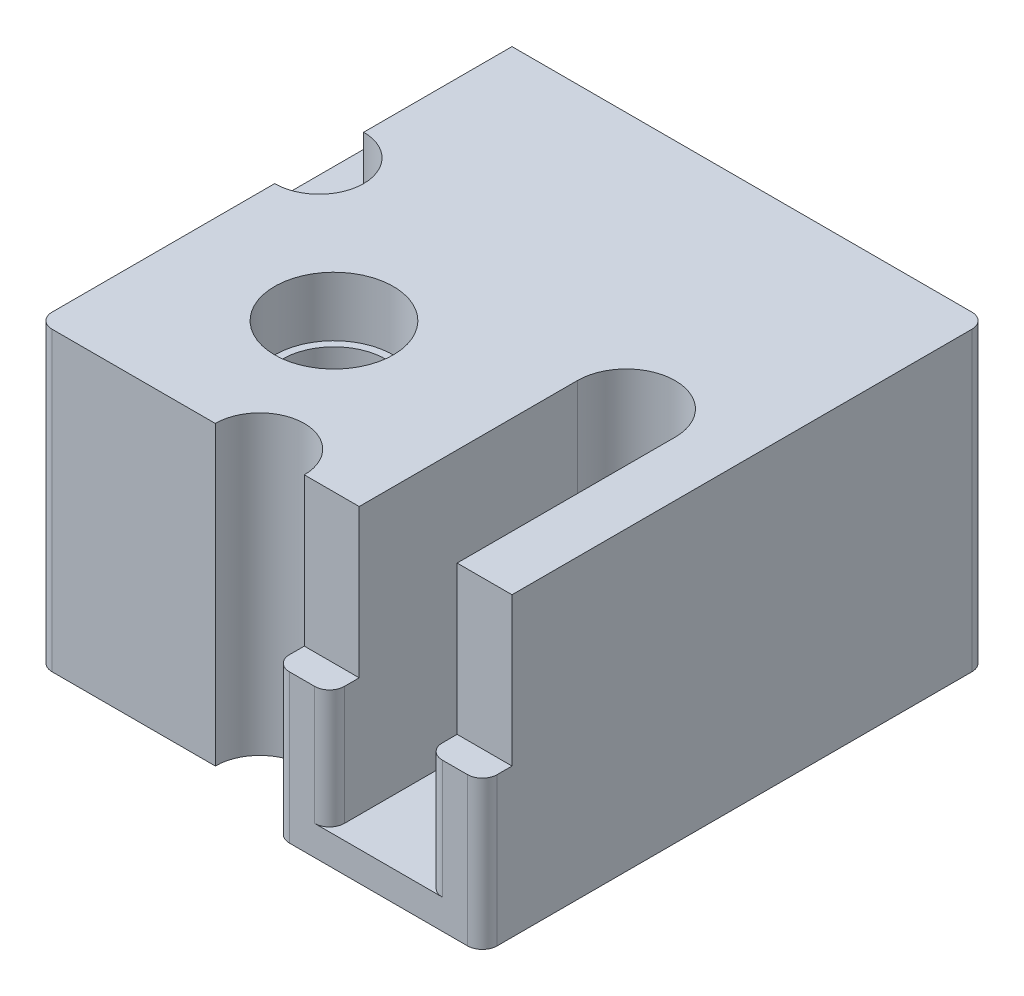
ISO-10303-21;
HEADER;
FILE_DESCRIPTION(('STEP AP214'),'2;1');
FILE_NAME('part.step','',(''),(''),'','','');
FILE_SCHEMA(('AUTOMOTIVE_DESIGN { 1 0 10303 214 1 1 1 1 }'));
ENDSEC;
DATA;
#1=APPLICATION_CONTEXT('core data for automotive mechanical design processes');
#2=APPLICATION_PROTOCOL_DEFINITION('international standard','automotive_design',2000,#1);
#3=PRODUCT_CONTEXT('',#1,'mechanical');
#4=PRODUCT('Part','Part','',(#3));
#5=PRODUCT_RELATED_PRODUCT_CATEGORY('part','',(#4));
#6=PRODUCT_DEFINITION_FORMATION('','',#4);
#7=PRODUCT_DEFINITION_CONTEXT('part definition',#1,'design');
#8=PRODUCT_DEFINITION('design','',#6,#7);
#9=PRODUCT_DEFINITION_SHAPE('','',#8);
#10=(LENGTH_UNIT() NAMED_UNIT(*) SI_UNIT(.MILLI.,.METRE.));
#11=(NAMED_UNIT(*) PLANE_ANGLE_UNIT() SI_UNIT($,.RADIAN.));
#12=(NAMED_UNIT(*) SI_UNIT($,.STERADIAN.) SOLID_ANGLE_UNIT());
#13=UNCERTAINTY_MEASURE_WITH_UNIT(LENGTH_MEASURE(1.E-05),#10,'distance_accuracy_value','');
#14=(GEOMETRIC_REPRESENTATION_CONTEXT(3) GLOBAL_UNCERTAINTY_ASSIGNED_CONTEXT((#13)) GLOBAL_UNIT_ASSIGNED_CONTEXT((#10,
#11,#12)) REPRESENTATION_CONTEXT('',''));
#15=CARTESIAN_POINT('',(0.,0.,0.));
#16=DIRECTION('',(0.,0.,1.));
#17=DIRECTION('',(1.,0.,0.));
#18=AXIS2_PLACEMENT_3D('',#15,#16,#17);
#19=CARTESIAN_POINT('',(13.5,5.,16.));
#20=DIRECTION('',(0.,0.,-1.));
#21=DIRECTION('',(-1.,0.,0.));
#22=AXIS2_PLACEMENT_3D('',#19,#20,#21);
#23=PLANE('',#22);
#24=DIRECTION('',(-1.,0.,0.));
#25=VECTOR('',#24,1.);
#26=CARTESIAN_POINT('',(13.5,5.,16.));
#27=LINE('',#26,#25);
#28=CARTESIAN_POINT('',(15.35,5.,16.));
#29=VERTEX_POINT('',#28);
#30=CARTESIAN_POINT('',(13.5,5.,16.));
#31=VERTEX_POINT('',#30);
#32=EDGE_CURVE('E282',#29,#31,#27,.T.);
#33=ORIENTED_EDGE('',*,*,#32,.F.);
#34=DIRECTION('',(0.,1.,0.));
#35=VECTOR('',#34,1.);
#36=CARTESIAN_POINT('',(15.35,5.,16.));
#37=LINE('',#36,#35);
#38=CARTESIAN_POINT('',(15.35,10.,16.));
#39=VERTEX_POINT('',#38);
#40=EDGE_CURVE('E251',#29,#39,#37,.T.);
#41=ORIENTED_EDGE('',*,*,#40,.T.);
#42=DIRECTION('',(-1.,0.,0.));
#43=VECTOR('',#42,1.);
#44=CARTESIAN_POINT('',(13.5,10.,16.));
#45=LINE('',#44,#43);
#46=CARTESIAN_POINT('',(13.5,10.,16.));
#47=VERTEX_POINT('',#46);
#48=EDGE_CURVE('E271',#39,#47,#45,.T.);
#49=ORIENTED_EDGE('',*,*,#48,.T.);
#50=DIRECTION('',(0.,-1.,0.));
#51=VECTOR('',#50,1.);
#52=CARTESIAN_POINT('',(13.5,10.,16.));
#53=LINE('',#52,#51);
#54=EDGE_CURVE('E348',#47,#31,#53,.T.);
#55=ORIENTED_EDGE('',*,*,#54,.T.);
#56=EDGE_LOOP('',(#33,#41,#49,#55));
#57=FACE_BOUND('',#56,.T.);
#58=ADVANCED_FACE('F34',(#57),#23,.F.);
#59=CARTESIAN_POINT('',(0.,5.,0.));
#60=DIRECTION('',(0.,1.,0.));
#61=DIRECTION('',(0.,0.,1.));
#62=AXIS2_PLACEMENT_3D('',#59,#60,#61);
#63=PLANE('',#62);
#64=DIRECTION('',(1.,0.,0.));
#65=VECTOR('',#64,1.);
#66=CARTESIAN_POINT('',(13.5,5.,17.));
#67=LINE('',#66,#65);
#68=CARTESIAN_POINT('',(14.,5.,17.));
#69=VERTEX_POINT('',#68);
#70=CARTESIAN_POINT('',(14.85,5.,17.));
#71=VERTEX_POINT('',#70);
#72=EDGE_CURVE('E277',#69,#71,#67,.T.);
#73=ORIENTED_EDGE('',*,*,#72,.T.);
#74=CARTESIAN_POINT('',(14.85,5.,16.5));
#75=DIRECTION('',(0.,1.,0.));
#76=DIRECTION('',(0.,0.,1.));
#77=AXIS2_PLACEMENT_3D('',#74,#75,#76);
#78=CIRCLE('',#77,0.5);
#79=CARTESIAN_POINT('',(15.35,5.,16.5));
#80=VERTEX_POINT('',#79);
#81=EDGE_CURVE('E383',#71,#80,#78,.T.);
#82=ORIENTED_EDGE('',*,*,#81,.T.);
#83=DIRECTION('',(0.,0.,1.));
#84=VECTOR('',#83,1.);
#85=CARTESIAN_POINT('',(15.35,5.,0.));
#86=LINE('',#85,#84);
#87=EDGE_CURVE('E359',#29,#80,#86,.T.);
#88=ORIENTED_EDGE('',*,*,#87,.F.);
#89=ORIENTED_EDGE('',*,*,#32,.T.);
#90=DIRECTION('',(0.,0.,1.));
#91=VECTOR('',#90,1.);
#92=CARTESIAN_POINT('',(13.5,5.,16.));
#93=LINE('',#92,#91);
#94=CARTESIAN_POINT('',(13.5,5.,16.5));
#95=VERTEX_POINT('',#94);
#96=EDGE_CURVE('E272',#31,#95,#93,.T.);
#97=ORIENTED_EDGE('',*,*,#96,.T.);
#98=CARTESIAN_POINT('',(14.,5.,16.5));
#99=DIRECTION('',(0.,1.,0.));
#100=DIRECTION('',(0.,0.,1.));
#101=AXIS2_PLACEMENT_3D('',#98,#99,#100);
#102=CIRCLE('',#101,0.5);
#103=EDGE_CURVE('E381',#95,#69,#102,.T.);
#104=ORIENTED_EDGE('',*,*,#103,.T.);
#105=EDGE_LOOP('',(#73,#82,#88,#89,#97,#104));
#106=FACE_BOUND('',#105,.T.);
#107=ADVANCED_FACE('F458',(#106),#63,.T.);
#108=CARTESIAN_POINT('',(0.,10.,0.));
#109=DIRECTION('',(1.,0.,0.));
#110=DIRECTION('',(0.,0.,-1.));
#111=AXIS2_PLACEMENT_3D('',#108,#109,#110);
#112=PLANE('',#111);
#113=DIRECTION('',(0.,0.,1.));
#114=VECTOR('',#113,1.);
#115=CARTESIAN_POINT('',(0.,5.,5.));
#116=LINE('',#115,#114);
#117=CARTESIAN_POINT('',(0.,5.,0.5));
#118=VERTEX_POINT('',#117);
#119=CARTESIAN_POINT('',(0.,5.,4.5));
#120=VERTEX_POINT('',#119);
#121=EDGE_CURVE('E261',#118,#120,#116,.T.);
#122=ORIENTED_EDGE('',*,*,#121,.F.);
#123=DIRECTION('',(0.,-1.,0.));
#124=VECTOR('',#123,1.);
#125=CARTESIAN_POINT('',(0.,10.,0.5));
#126=LINE('',#125,#124);
#127=CARTESIAN_POINT('',(0.,0.,0.5));
#128=VERTEX_POINT('',#127);
#129=EDGE_CURVE('E389',#118,#128,#126,.T.);
#130=ORIENTED_EDGE('',*,*,#129,.T.);
#131=DIRECTION('',(0.,0.,1.));
#132=VECTOR('',#131,1.);
#133=CARTESIAN_POINT('',(0.,0.,0.));
#134=LINE('',#133,#132);
#135=CARTESIAN_POINT('',(0.,0.,4.5));
#136=VERTEX_POINT('',#135);
#137=EDGE_CURVE('E334',#128,#136,#134,.T.);
#138=ORIENTED_EDGE('',*,*,#137,.T.);
#139=DIRECTION('',(0.,-1.,0.));
#140=VECTOR('',#139,1.);
#141=CARTESIAN_POINT('',(0.,10.,4.5));
#142=LINE('',#141,#140);
#143=EDGE_CURVE('E387',#136,#120,#142,.F.);
#144=ORIENTED_EDGE('',*,*,#143,.T.);
#145=EDGE_LOOP('',(#122,#130,#138,#144));
#146=FACE_BOUND('',#145,.T.);
#147=ADVANCED_FACE('F496',(#146),#112,.F.);
#148=CARTESIAN_POINT('',(4.5,10.,5.));
#149=DIRECTION('',(0.,0.,-1.));
#150=DIRECTION('',(-1.,0.,0.));
#151=AXIS2_PLACEMENT_3D('',#148,#149,#150);
#152=PLANE('',#151);
#153=DIRECTION('',(1.,0.,0.));
#154=VECTOR('',#153,1.);
#155=CARTESIAN_POINT('',(4.5,5.,5.));
#156=LINE('',#155,#154);
#157=CARTESIAN_POINT('',(0.500000000000001,5.,5.));
#158=VERTEX_POINT('',#157);
#159=CARTESIAN_POINT('',(4.5,5.,5.));
#160=VERTEX_POINT('',#159);
#161=EDGE_CURVE('E264',#158,#160,#156,.T.);
#162=ORIENTED_EDGE('',*,*,#161,.F.);
#163=DIRECTION('',(0.,-1.,0.));
#164=VECTOR('',#163,1.);
#165=CARTESIAN_POINT('',(0.500000000000001,10.,5.));
#166=LINE('',#165,#164);
#167=CARTESIAN_POINT('',(0.500000000000001,0.,5.));
#168=VERTEX_POINT('',#167);
#169=EDGE_CURVE('E413',#158,#168,#166,.T.);
#170=ORIENTED_EDGE('',*,*,#169,.T.);
#171=DIRECTION('',(1.,0.,0.));
#172=VECTOR('',#171,1.);
#173=CARTESIAN_POINT('',(4.5,0.,5.));
#174=LINE('',#173,#172);
#175=CARTESIAN_POINT('',(4.5,0.,5.));
#176=VERTEX_POINT('',#175);
#177=EDGE_CURVE('E337',#168,#176,#174,.T.);
#178=ORIENTED_EDGE('',*,*,#177,.T.);
#179=DIRECTION('',(0.,-1.,0.));
#180=VECTOR('',#179,1.);
#181=CARTESIAN_POINT('',(4.5,10.,5.));
#182=LINE('',#181,#180);
#183=EDGE_CURVE('E351',#160,#176,#182,.T.);
#184=ORIENTED_EDGE('',*,*,#183,.F.);
#185=EDGE_LOOP('',(#162,#170,#178,#184));
#186=FACE_BOUND('',#185,.T.);
#187=ADVANCED_FACE('F507',(#186),#152,.F.);
#188=CARTESIAN_POINT('',(13.5,10.,16.));
#189=DIRECTION('',(1.,0.,0.));
#190=DIRECTION('',(0.,0.,-1.));
#191=AXIS2_PLACEMENT_3D('',#188,#189,#190);
#192=PLANE('',#191);
#193=DIRECTION('',(0.,0.,1.));
#194=VECTOR('',#193,1.);
#195=CARTESIAN_POINT('',(13.5,0.,16.));
#196=LINE('',#195,#194);
#197=CARTESIAN_POINT('',(13.5,0.,16.));
#198=VERTEX_POINT('',#197);
#199=CARTESIAN_POINT('',(13.5,0.,16.5));
#200=VERTEX_POINT('',#199);
#201=EDGE_CURVE('E343',#198,#200,#196,.T.);
#202=ORIENTED_EDGE('',*,*,#201,.T.);
#203=DIRECTION('',(0.,-1.,0.));
#204=VECTOR('',#203,1.);
#205=CARTESIAN_POINT('',(13.5,10.,16.5));
#206=LINE('',#205,#204);
#207=EDGE_CURVE('E424',#200,#95,#206,.F.);
#208=ORIENTED_EDGE('',*,*,#207,.T.);
#209=ORIENTED_EDGE('',*,*,#96,.F.);
#210=EDGE_CURVE('E328',#31,#198,#53,.T.);
#211=ORIENTED_EDGE('',*,*,#210,.T.);
#212=EDGE_LOOP('',(#202,#208,#209,#211));
#213=FACE_BOUND('',#212,.T.);
#214=ADVANCED_FACE('F562',(#213),#192,.F.);
#215=CARTESIAN_POINT('',(20.5,10.,17.));
#216=DIRECTION('',(0.,0.,-1.));
#217=DIRECTION('',(-1.,0.,0.));
#218=AXIS2_PLACEMENT_3D('',#215,#216,#217);
#219=PLANE('',#218);
#220=CARTESIAN_POINT('',(19.15,5.,17.));
#221=VERTEX_POINT('',#220);
#222=CARTESIAN_POINT('',(20.,5.,17.));
#223=VERTEX_POINT('',#222);
#224=EDGE_CURVE('E275',#221,#223,#67,.T.);
#225=ORIENTED_EDGE('',*,*,#224,.F.);
#226=DIRECTION('',(0.,1.,0.));
#227=VECTOR('',#226,1.);
#228=CARTESIAN_POINT('',(19.15,10.,17.));
#229=LINE('',#228,#227);
#230=CARTESIAN_POINT('',(19.15,1.,17.));
#231=VERTEX_POINT('',#230);
#232=EDGE_CURVE('E378',#221,#231,#229,.F.);
#233=ORIENTED_EDGE('',*,*,#232,.T.);
#234=DIRECTION('',(1.,0.,0.));
#235=VECTOR('',#234,1.);
#236=CARTESIAN_POINT('',(20.5,1.,17.));
#237=LINE('',#236,#235);
#238=CARTESIAN_POINT('',(14.85,1.,17.));
#239=VERTEX_POINT('',#238);
#240=EDGE_CURVE('E362',#239,#231,#237,.T.);
#241=ORIENTED_EDGE('',*,*,#240,.F.);
#242=DIRECTION('',(0.,1.,0.));
#243=VECTOR('',#242,1.);
#244=CARTESIAN_POINT('',(14.85,10.,17.));
#245=LINE('',#244,#243);
#246=EDGE_CURVE('E375',#239,#71,#245,.T.);
#247=ORIENTED_EDGE('',*,*,#246,.T.);
#248=ORIENTED_EDGE('',*,*,#72,.F.);
#249=DIRECTION('',(0.,-1.,0.));
#250=VECTOR('',#249,1.);
#251=CARTESIAN_POINT('',(14.,10.,17.));
#252=LINE('',#251,#250);
#253=CARTESIAN_POINT('',(14.,0.,17.));
#254=VERTEX_POINT('',#253);
#255=EDGE_CURVE('E372',#69,#254,#252,.T.);
#256=ORIENTED_EDGE('',*,*,#255,.T.);
#257=DIRECTION('',(1.,0.,0.));
#258=VECTOR('',#257,1.);
#259=CARTESIAN_POINT('',(20.5,0.,17.));
#260=LINE('',#259,#258);
#261=CARTESIAN_POINT('',(20.,0.,17.));
#262=VERTEX_POINT('',#261);
#263=EDGE_CURVE('E322',#254,#262,#260,.T.);
#264=ORIENTED_EDGE('',*,*,#263,.T.);
#265=DIRECTION('',(0.,-1.,0.));
#266=VECTOR('',#265,1.);
#267=CARTESIAN_POINT('',(20.,10.,17.));
#268=LINE('',#267,#266);
#269=EDGE_CURVE('E370',#262,#223,#268,.F.);
#270=ORIENTED_EDGE('',*,*,#269,.T.);
#271=EDGE_LOOP('',(#225,#233,#241,#247,#248,#256,#264,#270));
#272=FACE_BOUND('',#271,.T.);
#273=ADVANCED_FACE('F466',(#272),#219,.F.);
#274=CARTESIAN_POINT('',(9.5,0.,11.));
#275=DIRECTION('',(0.,1.,0.));
#276=DIRECTION('',(0.,0.,1.));
#277=AXIS2_PLACEMENT_3D('',#274,#275,#276);
#278=CYLINDRICAL_SURFACE('',#277,1.75);
#279=CARTESIAN_POINT('',(9.5,0.,11.));
#280=DIRECTION('',(0.,1.,0.));
#281=DIRECTION('',(0.,0.,1.));
#282=AXIS2_PLACEMENT_3D('',#279,#280,#281);
#283=CIRCLE('',#282,1.75);
#284=CARTESIAN_POINT('',(9.5,0.,12.75));
#285=VERTEX_POINT('',#284);
#286=EDGE_CURVE('E314',#285,#285,#283,.T.);
#287=ORIENTED_EDGE('',*,*,#286,.F.);
#288=EDGE_LOOP('',(#287));
#289=FACE_BOUND('',#288,.T.);
#290=CARTESIAN_POINT('',(9.5,8.,11.));
#291=DIRECTION('',(0.,1.,0.));
#292=DIRECTION('',(0.,0.,1.));
#293=AXIS2_PLACEMENT_3D('',#290,#291,#292);
#294=CIRCLE('',#293,1.75);
#295=CARTESIAN_POINT('',(9.5,8.,12.75));
#296=VERTEX_POINT('',#295);
#297=EDGE_CURVE('E311',#296,#296,#294,.F.);
#298=ORIENTED_EDGE('',*,*,#297,.F.);
#299=EDGE_LOOP('',(#298));
#300=FACE_BOUND('',#299,.T.);
#301=ADVANCED_FACE('F551',(#289,#300),#278,.F.);
#302=CARTESIAN_POINT('',(20.5,10.,0.));
#303=DIRECTION('',(-1.,0.,0.));
#304=DIRECTION('',(0.,0.,1.));
#305=AXIS2_PLACEMENT_3D('',#302,#303,#304);
#306=PLANE('',#305);
#307=DIRECTION('',(0.,0.,-1.));
#308=VECTOR('',#307,1.);
#309=CARTESIAN_POINT('',(20.5,0.,0.));
#310=LINE('',#309,#308);
#311=CARTESIAN_POINT('',(20.5,0.,16.5));
#312=VERTEX_POINT('',#311);
#313=CARTESIAN_POINT('',(20.5,0.,0.5));
#314=VERTEX_POINT('',#313);
#315=EDGE_CURVE('E317',#312,#314,#310,.T.);
#316=ORIENTED_EDGE('',*,*,#315,.T.);
#317=DIRECTION('',(0.,-1.,0.));
#318=VECTOR('',#317,1.);
#319=CARTESIAN_POINT('',(20.5,10.,0.5));
#320=LINE('',#319,#318);
#321=CARTESIAN_POINT('',(20.5,10.,0.5));
#322=VERTEX_POINT('',#321);
#323=EDGE_CURVE('E419',#314,#322,#320,.F.);
#324=ORIENTED_EDGE('',*,*,#323,.T.);
#325=DIRECTION('',(0.,0.,-1.));
#326=VECTOR('',#325,1.);
#327=CARTESIAN_POINT('',(20.5,10.,0.));
#328=LINE('',#327,#326);
#329=CARTESIAN_POINT('',(20.5,10.,16.));
#330=VERTEX_POINT('',#329);
#331=EDGE_CURVE('E318',#330,#322,#328,.T.);
#332=ORIENTED_EDGE('',*,*,#331,.F.);
#333=DIRECTION('',(0.,1.,0.));
#334=VECTOR('',#333,1.);
#335=CARTESIAN_POINT('',(20.5,5.,16.));
#336=LINE('',#335,#334);
#337=CARTESIAN_POINT('',(20.5,5.,16.));
#338=VERTEX_POINT('',#337);
#339=EDGE_CURVE('E286',#338,#330,#336,.T.);
#340=ORIENTED_EDGE('',*,*,#339,.F.);
#341=DIRECTION('',(0.,0.,-1.));
#342=VECTOR('',#341,1.);
#343=CARTESIAN_POINT('',(20.5,5.,16.));
#344=LINE('',#343,#342);
#345=CARTESIAN_POINT('',(20.5,5.,16.5));
#346=VERTEX_POINT('',#345);
#347=EDGE_CURVE('E280',#346,#338,#344,.T.);
#348=ORIENTED_EDGE('',*,*,#347,.F.);
#349=DIRECTION('',(0.,-1.,0.));
#350=VECTOR('',#349,1.);
#351=CARTESIAN_POINT('',(20.5,10.,16.5));
#352=LINE('',#351,#350);
#353=EDGE_CURVE('E416',#346,#312,#352,.T.);
#354=ORIENTED_EDGE('',*,*,#353,.T.);
#355=EDGE_LOOP('',(#316,#324,#332,#340,#348,#354));
#356=FACE_BOUND('',#355,.T.);
#357=ADVANCED_FACE('F477',(#356),#306,.F.);
#358=CARTESIAN_POINT('',(0.,10.,0.));
#359=DIRECTION('',(0.,0.,1.));
#360=DIRECTION('',(1.,0.,0.));
#361=AXIS2_PLACEMENT_3D('',#358,#359,#360);
#362=PLANE('',#361);
#363=DIRECTION('',(-1.,0.,0.));
#364=VECTOR('',#363,1.);
#365=CARTESIAN_POINT('',(0.,0.,0.));
#366=LINE('',#365,#364);
#367=CARTESIAN_POINT('',(20.,0.,0.));
#368=VERTEX_POINT('',#367);
#369=CARTESIAN_POINT('',(0.5,0.,0.));
#370=VERTEX_POINT('',#369);
#371=EDGE_CURVE('E331',#368,#370,#366,.T.);
#372=ORIENTED_EDGE('',*,*,#371,.T.);
#373=DIRECTION('',(0.,-1.,0.));
#374=VECTOR('',#373,1.);
#375=CARTESIAN_POINT('',(0.5,10.,0.));
#376=LINE('',#375,#374);
#377=CARTESIAN_POINT('',(0.5,5.,0.));
#378=VERTEX_POINT('',#377);
#379=EDGE_CURVE('E407',#370,#378,#376,.F.);
#380=ORIENTED_EDGE('',*,*,#379,.T.);
#381=DIRECTION('',(-1.,0.,0.));
#382=VECTOR('',#381,1.);
#383=CARTESIAN_POINT('',(4.5,5.,0.));
#384=LINE('',#383,#382);
#385=CARTESIAN_POINT('',(4.5,5.,0.));
#386=VERTEX_POINT('',#385);
#387=EDGE_CURVE('E258',#386,#378,#384,.T.);
#388=ORIENTED_EDGE('',*,*,#387,.F.);
#389=DIRECTION('',(0.,1.,0.));
#390=VECTOR('',#389,1.);
#391=CARTESIAN_POINT('',(4.5,5.,0.));
#392=LINE('',#391,#390);
#393=CARTESIAN_POINT('',(4.5,10.,0.));
#394=VERTEX_POINT('',#393);
#395=EDGE_CURVE('E266',#386,#394,#392,.T.);
#396=ORIENTED_EDGE('',*,*,#395,.T.);
#397=DIRECTION('',(-1.,0.,0.));
#398=VECTOR('',#397,1.);
#399=CARTESIAN_POINT('',(0.,10.,0.));
#400=LINE('',#399,#398);
#401=CARTESIAN_POINT('',(20.,10.,0.));
#402=VERTEX_POINT('',#401);
#403=EDGE_CURVE('E321',#402,#394,#400,.T.);
#404=ORIENTED_EDGE('',*,*,#403,.F.);
#405=DIRECTION('',(0.,-1.,0.));
#406=VECTOR('',#405,1.);
#407=CARTESIAN_POINT('',(20.,10.,0.));
#408=LINE('',#407,#406);
#409=EDGE_CURVE('E404',#402,#368,#408,.T.);
#410=ORIENTED_EDGE('',*,*,#409,.T.);
#411=EDGE_LOOP('',(#372,#380,#388,#396,#404,#410));
#412=FACE_BOUND('',#411,.T.);
#413=ADVANCED_FACE('F487',(#412),#362,.F.);
#414=CARTESIAN_POINT('',(4.5,10.,5.));
#415=DIRECTION('',(1.,0.,0.));
#416=DIRECTION('',(0.,0.,-1.));
#417=AXIS2_PLACEMENT_3D('',#414,#415,#416);
#418=PLANE('',#417);
#419=DIRECTION('',(0.,0.,1.));
#420=VECTOR('',#419,1.);
#421=CARTESIAN_POINT('',(4.5,0.,5.));
#422=LINE('',#421,#420);
#423=CARTESIAN_POINT('',(4.5,0.,8.));
#424=VERTEX_POINT('',#423);
#425=CARTESIAN_POINT('',(4.5,0.,15.5));
#426=VERTEX_POINT('',#425);
#427=EDGE_CURVE('E339',#424,#426,#422,.T.);
#428=ORIENTED_EDGE('',*,*,#427,.T.);
#429=DIRECTION('',(0.,-1.,0.));
#430=VECTOR('',#429,1.);
#431=CARTESIAN_POINT('',(4.5,10.,15.5));
#432=LINE('',#431,#430);
#433=CARTESIAN_POINT('',(4.5,10.,15.5));
#434=VERTEX_POINT('',#433);
#435=EDGE_CURVE('E57',#426,#434,#432,.F.);
#436=ORIENTED_EDGE('',*,*,#435,.T.);
#437=DIRECTION('',(0.,0.,1.));
#438=VECTOR('',#437,1.);
#439=CARTESIAN_POINT('',(4.5,10.,5.));
#440=LINE('',#439,#438);
#441=CARTESIAN_POINT('',(4.5,10.,8.));
#442=VERTEX_POINT('',#441);
#443=EDGE_CURVE('E324',#442,#434,#440,.T.);
#444=ORIENTED_EDGE('',*,*,#443,.F.);
#445=DIRECTION('',(0.,-1.,0.));
#446=VECTOR('',#445,1.);
#447=CARTESIAN_POINT('',(4.5,10.,8.));
#448=LINE('',#447,#446);
#449=EDGE_CURVE('E303',#442,#424,#448,.T.);
#450=ORIENTED_EDGE('',*,*,#449,.T.);
#451=EDGE_LOOP('',(#428,#436,#444,#450));
#452=FACE_BOUND('',#451,.T.);
#453=ADVANCED_FACE('F514',(#452),#418,.F.);
#454=CARTESIAN_POINT('',(4.5,10.,16.));
#455=DIRECTION('',(0.,0.,-1.));
#456=DIRECTION('',(-1.,0.,0.));
#457=AXIS2_PLACEMENT_3D('',#454,#455,#456);
#458=PLANE('',#457);
#459=DIRECTION('',(1.,0.,0.));
#460=VECTOR('',#459,1.);
#461=CARTESIAN_POINT('',(4.5,10.,16.));
#462=LINE('',#461,#460);
#463=CARTESIAN_POINT('',(5.,10.,16.));
#464=VERTEX_POINT('',#463);
#465=CARTESIAN_POINT('',(10.5,10.,16.));
#466=VERTEX_POINT('',#465);
#467=EDGE_CURVE('E326',#464,#466,#462,.T.);
#468=ORIENTED_EDGE('',*,*,#467,.F.);
#469=DIRECTION('',(0.,-1.,0.));
#470=VECTOR('',#469,1.);
#471=CARTESIAN_POINT('',(5.,10.,16.));
#472=LINE('',#471,#470);
#473=CARTESIAN_POINT('',(5.,0.,16.));
#474=VERTEX_POINT('',#473);
#475=EDGE_CURVE('E426',#464,#474,#472,.T.);
#476=ORIENTED_EDGE('',*,*,#475,.T.);
#477=DIRECTION('',(1.,0.,0.));
#478=VECTOR('',#477,1.);
#479=CARTESIAN_POINT('',(4.5,0.,16.));
#480=LINE('',#479,#478);
#481=CARTESIAN_POINT('',(10.5,0.,16.));
#482=VERTEX_POINT('',#481);
#483=EDGE_CURVE('E341',#474,#482,#480,.T.);
#484=ORIENTED_EDGE('',*,*,#483,.T.);
#485=DIRECTION('',(0.,-1.,0.));
#486=VECTOR('',#485,1.);
#487=CARTESIAN_POINT('',(10.5,10.,16.));
#488=LINE('',#487,#486);
#489=EDGE_CURVE('E294',#466,#482,#488,.T.);
#490=ORIENTED_EDGE('',*,*,#489,.F.);
#491=EDGE_LOOP('',(#468,#476,#484,#490));
#492=FACE_BOUND('',#491,.T.);
#493=ADVANCED_FACE('F432',(#492),#458,.F.);
#494=CARTESIAN_POINT('',(20.5,10.,17.));
#495=DIRECTION('',(0.,-1.,0.));
#496=DIRECTION('',(0.,0.,-1.));
#497=AXIS2_PLACEMENT_3D('',#494,#495,#496);
#498=PLANE('',#497);
#499=CARTESIAN_POINT('',(9.5,10.,11.));
#500=DIRECTION('',(0.,1.,0.));
#501=DIRECTION('',(0.,0.,1.));
#502=AXIS2_PLACEMENT_3D('',#499,#500,#501);
#503=CIRCLE('',#502,2.);
#504=CARTESIAN_POINT('',(9.5,10.,13.));
#505=VERTEX_POINT('',#504);
#506=EDGE_CURVE('E307',#505,#505,#503,.T.);
#507=ORIENTED_EDGE('',*,*,#506,.F.);
#508=EDGE_LOOP('',(#507));
#509=FACE_BOUND('',#508,.T.);
#510=ORIENTED_EDGE('',*,*,#331,.T.);
#511=CARTESIAN_POINT('',(20.,10.,0.5));
#512=DIRECTION('',(0.,-1.,0.));
#513=DIRECTION('',(0.,0.,-1.));
#514=AXIS2_PLACEMENT_3D('',#511,#512,#513);
#515=CIRCLE('',#514,0.5);
#516=EDGE_CURVE('E422',#322,#402,#515,.F.);
#517=ORIENTED_EDGE('',*,*,#516,.T.);
#518=ORIENTED_EDGE('',*,*,#403,.T.);
#519=DIRECTION('',(0.,0.,-1.));
#520=VECTOR('',#519,1.);
#521=CARTESIAN_POINT('',(4.5,10.,5.));
#522=LINE('',#521,#520);
#523=CARTESIAN_POINT('',(4.5,10.,5.));
#524=VERTEX_POINT('',#523);
#525=EDGE_CURVE('E254',#524,#394,#522,.T.);
#526=ORIENTED_EDGE('',*,*,#525,.F.);
#527=CARTESIAN_POINT('',(4.5,10.,6.5));
#528=DIRECTION('',(0.,-1.,0.));
#529=DIRECTION('',(0.,0.,-1.));
#530=AXIS2_PLACEMENT_3D('',#527,#528,#529);
#531=CIRCLE('',#530,1.5);
#532=EDGE_CURVE('E300',#524,#442,#531,.T.);
#533=ORIENTED_EDGE('',*,*,#532,.T.);
#534=ORIENTED_EDGE('',*,*,#443,.T.);
#535=CARTESIAN_POINT('',(5.,10.,15.5));
#536=DIRECTION('',(0.,-1.,0.));
#537=DIRECTION('',(0.,0.,-1.));
#538=AXIS2_PLACEMENT_3D('',#535,#536,#537);
#539=CIRCLE('',#538,0.5);
#540=EDGE_CURVE('E49',#434,#464,#539,.F.);
#541=ORIENTED_EDGE('',*,*,#540,.T.);
#542=ORIENTED_EDGE('',*,*,#467,.T.);
#543=CARTESIAN_POINT('',(12.,10.,16.));
#544=DIRECTION('',(0.,-1.,0.));
#545=DIRECTION('',(0.,0.,-1.));
#546=AXIS2_PLACEMENT_3D('',#543,#544,#545);
#547=CIRCLE('',#546,1.5);
#548=EDGE_CURVE('E291',#466,#47,#547,.T.);
#549=ORIENTED_EDGE('',*,*,#548,.T.);
#550=ORIENTED_EDGE('',*,*,#48,.F.);
#551=DIRECTION('',(0.,0.,1.));
#552=VECTOR('',#551,1.);
#553=CARTESIAN_POINT('',(15.35,10.,17.));
#554=LINE('',#553,#552);
#555=CARTESIAN_POINT('',(15.35,10.,8.65));
#556=VERTEX_POINT('',#555);
#557=EDGE_CURVE('E226',#556,#39,#554,.T.);
#558=ORIENTED_EDGE('',*,*,#557,.F.);
#559=CARTESIAN_POINT('',(17.,10.,8.65));
#560=DIRECTION('',(0.,1.,0.));
#561=DIRECTION('',(0.,0.,1.));
#562=AXIS2_PLACEMENT_3D('',#559,#560,#561);
#563=CIRCLE('',#562,1.65);
#564=CARTESIAN_POINT('',(18.65,10.,8.65));
#565=VERTEX_POINT('',#564);
#566=EDGE_CURVE('E244',#565,#556,#563,.T.);
#567=ORIENTED_EDGE('',*,*,#566,.F.);
#568=DIRECTION('',(0.,0.,-1.));
#569=VECTOR('',#568,1.);
#570=CARTESIAN_POINT('',(18.65,10.,17.));
#571=LINE('',#570,#569);
#572=CARTESIAN_POINT('',(18.65,10.,16.));
#573=VERTEX_POINT('',#572);
#574=EDGE_CURVE('E232',#573,#565,#571,.T.);
#575=ORIENTED_EDGE('',*,*,#574,.F.);
#576=EDGE_CURVE('E276',#330,#573,#45,.T.);
#577=ORIENTED_EDGE('',*,*,#576,.F.);
#578=EDGE_LOOP('',(#510,#517,#518,#526,#533,#534,#541,#542,#549,#550,#558,#567,#575,#577));
#579=FACE_BOUND('',#578,.T.);
#580=ADVANCED_FACE('F448',(#509,#579),#498,.F.);
#581=CARTESIAN_POINT('',(20.5,0.,17.));
#582=DIRECTION('',(0.,-1.,0.));
#583=DIRECTION('',(0.,0.,-1.));
#584=AXIS2_PLACEMENT_3D('',#581,#582,#583);
#585=PLANE('',#584);
#586=ORIENTED_EDGE('',*,*,#137,.F.);
#587=CARTESIAN_POINT('',(0.5,0.,0.5));
#588=DIRECTION('',(0.,-1.,0.));
#589=DIRECTION('',(0.,0.,-1.));
#590=AXIS2_PLACEMENT_3D('',#587,#588,#589);
#591=CIRCLE('',#590,0.5);
#592=EDGE_CURVE('E402',#128,#370,#591,.T.);
#593=ORIENTED_EDGE('',*,*,#592,.T.);
#594=ORIENTED_EDGE('',*,*,#371,.F.);
#595=CARTESIAN_POINT('',(20.,0.,0.5));
#596=DIRECTION('',(0.,-1.,0.));
#597=DIRECTION('',(0.,0.,-1.));
#598=AXIS2_PLACEMENT_3D('',#595,#596,#597);
#599=CIRCLE('',#598,0.5);
#600=EDGE_CURVE('E398',#368,#314,#599,.T.);
#601=ORIENTED_EDGE('',*,*,#600,.T.);
#602=ORIENTED_EDGE('',*,*,#315,.F.);
#603=CARTESIAN_POINT('',(20.,0.,16.5));
#604=DIRECTION('',(0.,-1.,0.));
#605=DIRECTION('',(0.,0.,-1.));
#606=AXIS2_PLACEMENT_3D('',#603,#604,#605);
#607=CIRCLE('',#606,0.5);
#608=EDGE_CURVE('E394',#312,#262,#607,.T.);
#609=ORIENTED_EDGE('',*,*,#608,.T.);
#610=ORIENTED_EDGE('',*,*,#263,.F.);
#611=CARTESIAN_POINT('',(14.,0.,16.5));
#612=DIRECTION('',(0.,-1.,0.));
#613=DIRECTION('',(0.,0.,-1.));
#614=AXIS2_PLACEMENT_3D('',#611,#612,#613);
#615=CIRCLE('',#614,0.5);
#616=EDGE_CURVE('E396',#254,#200,#615,.T.);
#617=ORIENTED_EDGE('',*,*,#616,.T.);
#618=ORIENTED_EDGE('',*,*,#201,.F.);
#619=CARTESIAN_POINT('',(12.,0.,16.));
#620=DIRECTION('',(0.,-1.,0.));
#621=DIRECTION('',(0.,0.,-1.));
#622=AXIS2_PLACEMENT_3D('',#619,#620,#621);
#623=CIRCLE('',#622,1.5);
#624=EDGE_CURVE('E290',#482,#198,#623,.T.);
#625=ORIENTED_EDGE('',*,*,#624,.F.);
#626=ORIENTED_EDGE('',*,*,#483,.F.);
#627=CARTESIAN_POINT('',(5.,0.,15.5));
#628=DIRECTION('',(0.,-1.,0.));
#629=DIRECTION('',(0.,0.,-1.));
#630=AXIS2_PLACEMENT_3D('',#627,#628,#629);
#631=CIRCLE('',#630,0.5);
#632=EDGE_CURVE('E392',#474,#426,#631,.T.);
#633=ORIENTED_EDGE('',*,*,#632,.T.);
#634=ORIENTED_EDGE('',*,*,#427,.F.);
#635=CARTESIAN_POINT('',(4.5,0.,6.5));
#636=DIRECTION('',(0.,-1.,0.));
#637=DIRECTION('',(0.,0.,-1.));
#638=AXIS2_PLACEMENT_3D('',#635,#636,#637);
#639=CIRCLE('',#638,1.5);
#640=EDGE_CURVE('E299',#176,#424,#639,.T.);
#641=ORIENTED_EDGE('',*,*,#640,.F.);
#642=ORIENTED_EDGE('',*,*,#177,.F.);
#643=CARTESIAN_POINT('',(0.500000000000001,0.,4.5));
#644=DIRECTION('',(0.,-1.,0.));
#645=DIRECTION('',(0.,0.,-1.));
#646=AXIS2_PLACEMENT_3D('',#643,#644,#645);
#647=CIRCLE('',#646,0.5);
#648=EDGE_CURVE('E400',#168,#136,#647,.T.);
#649=ORIENTED_EDGE('',*,*,#648,.T.);
#650=EDGE_LOOP('',(#586,#593,#594,#601,#602,#609,#610,#617,#618,#625,#626,#633,#634,#641,#642,#649));
#651=FACE_BOUND('',#650,.T.);
#652=ORIENTED_EDGE('',*,*,#286,.T.);
#653=EDGE_LOOP('',(#652));
#654=FACE_BOUND('',#653,.T.);
#655=ADVANCED_FACE('F438',(#651,#654),#585,.T.);
#656=CARTESIAN_POINT('',(9.5,8.,11.));
#657=DIRECTION('',(0.,1.,0.));
#658=DIRECTION('',(0.,0.,1.));
#659=AXIS2_PLACEMENT_3D('',#656,#657,#658);
#660=PLANE('',#659);
#661=CARTESIAN_POINT('',(9.5,8.,11.));
#662=DIRECTION('',(0.,1.,0.));
#663=DIRECTION('',(0.,0.,1.));
#664=AXIS2_PLACEMENT_3D('',#661,#662,#663);
#665=CIRCLE('',#664,2.);
#666=CARTESIAN_POINT('',(9.5,8.,13.));
#667=VERTEX_POINT('',#666);
#668=EDGE_CURVE('E308',#667,#667,#665,.T.);
#669=ORIENTED_EDGE('',*,*,#668,.T.);
#670=EDGE_LOOP('',(#669));
#671=FACE_BOUND('',#670,.T.);
#672=ORIENTED_EDGE('',*,*,#297,.T.);
#673=EDGE_LOOP('',(#672));
#674=FACE_BOUND('',#673,.T.);
#675=ADVANCED_FACE('F544',(#671,#674),#660,.T.);
#676=CARTESIAN_POINT('',(9.5,8.,11.));
#677=DIRECTION('',(0.,1.,0.));
#678=DIRECTION('',(0.,0.,1.));
#679=AXIS2_PLACEMENT_3D('',#676,#677,#678);
#680=CYLINDRICAL_SURFACE('',#679,2.);
#681=ORIENTED_EDGE('',*,*,#668,.F.);
#682=EDGE_LOOP('',(#681));
#683=FACE_BOUND('',#682,.T.);
#684=ORIENTED_EDGE('',*,*,#506,.T.);
#685=EDGE_LOOP('',(#684));
#686=FACE_BOUND('',#685,.T.);
#687=ADVANCED_FACE('F541',(#683,#686),#680,.F.);
#688=CARTESIAN_POINT('',(4.5,10.,6.5));
#689=DIRECTION('',(0.,-1.,0.));
#690=DIRECTION('',(0.,0.,-1.));
#691=AXIS2_PLACEMENT_3D('',#688,#689,#690);
#692=CYLINDRICAL_SURFACE('',#691,1.5);
#693=ORIENTED_EDGE('',*,*,#640,.T.);
#694=ORIENTED_EDGE('',*,*,#449,.F.);
#695=ORIENTED_EDGE('',*,*,#532,.F.);
#696=EDGE_CURVE('E352',#524,#160,#182,.T.);
#697=ORIENTED_EDGE('',*,*,#696,.T.);
#698=ORIENTED_EDGE('',*,*,#183,.T.);
#699=EDGE_LOOP('',(#693,#694,#695,#697,#698));
#700=FACE_BOUND('',#699,.T.);
#701=ADVANCED_FACE('F512',(#700),#692,.F.);
#702=CARTESIAN_POINT('',(12.,10.,16.));
#703=DIRECTION('',(0.,-1.,0.));
#704=DIRECTION('',(0.,0.,-1.));
#705=AXIS2_PLACEMENT_3D('',#702,#703,#704);
#706=CYLINDRICAL_SURFACE('',#705,1.5);
#707=ORIENTED_EDGE('',*,*,#624,.T.);
#708=ORIENTED_EDGE('',*,*,#210,.F.);
#709=ORIENTED_EDGE('',*,*,#54,.F.);
#710=ORIENTED_EDGE('',*,*,#548,.F.);
#711=ORIENTED_EDGE('',*,*,#489,.T.);
#712=EDGE_LOOP('',(#707,#708,#709,#710,#711));
#713=FACE_BOUND('',#712,.T.);
#714=ADVANCED_FACE('F444',(#713),#706,.F.);
#715=ORIENTED_EDGE('',*,*,#576,.T.);
#716=DIRECTION('',(0.,-1.,0.));
#717=VECTOR('',#716,1.);
#718=CARTESIAN_POINT('',(18.65,5.,16.));
#719=LINE('',#718,#717);
#720=CARTESIAN_POINT('',(18.65,5.,16.));
#721=VERTEX_POINT('',#720);
#722=EDGE_CURVE('E247',#573,#721,#719,.T.);
#723=ORIENTED_EDGE('',*,*,#722,.T.);
#724=EDGE_CURVE('E283',#338,#721,#27,.T.);
#725=ORIENTED_EDGE('',*,*,#724,.F.);
#726=ORIENTED_EDGE('',*,*,#339,.T.);
#727=EDGE_LOOP('',(#715,#723,#725,#726));
#728=FACE_BOUND('',#727,.T.);
#729=ADVANCED_FACE('F472',(#728),#23,.F.);
#730=DIRECTION('',(0.,0.,-1.));
#731=VECTOR('',#730,1.);
#732=CARTESIAN_POINT('',(18.65,5.,0.));
#733=LINE('',#732,#731);
#734=CARTESIAN_POINT('',(18.65,5.,16.5));
#735=VERTEX_POINT('',#734);
#736=EDGE_CURVE('E355',#735,#721,#733,.T.);
#737=ORIENTED_EDGE('',*,*,#736,.F.);
#738=CARTESIAN_POINT('',(19.15,5.,16.5));
#739=DIRECTION('',(0.,1.,0.));
#740=DIRECTION('',(0.,0.,1.));
#741=AXIS2_PLACEMENT_3D('',#738,#739,#740);
#742=CIRCLE('',#741,0.5);
#743=EDGE_CURVE('E368',#735,#221,#742,.T.);
#744=ORIENTED_EDGE('',*,*,#743,.T.);
#745=ORIENTED_EDGE('',*,*,#224,.T.);
#746=CARTESIAN_POINT('',(20.,5.,16.5));
#747=DIRECTION('',(0.,1.,0.));
#748=DIRECTION('',(0.,0.,1.));
#749=AXIS2_PLACEMENT_3D('',#746,#747,#748);
#750=CIRCLE('',#749,0.5);
#751=EDGE_CURVE('E366',#223,#346,#750,.T.);
#752=ORIENTED_EDGE('',*,*,#751,.T.);
#753=ORIENTED_EDGE('',*,*,#347,.T.);
#754=ORIENTED_EDGE('',*,*,#724,.T.);
#755=EDGE_LOOP('',(#737,#744,#745,#752,#753,#754));
#756=FACE_BOUND('',#755,.T.);
#757=ADVANCED_FACE('F529',(#756),#63,.T.);
#758=CARTESIAN_POINT('',(4.5,5.,5.));
#759=DIRECTION('',(1.,0.,0.));
#760=DIRECTION('',(0.,0.,-1.));
#761=AXIS2_PLACEMENT_3D('',#758,#759,#760);
#762=PLANE('',#761);
#763=ORIENTED_EDGE('',*,*,#525,.T.);
#764=ORIENTED_EDGE('',*,*,#395,.F.);
#765=DIRECTION('',(0.,0.,-1.));
#766=VECTOR('',#765,1.);
#767=CARTESIAN_POINT('',(4.5,5.,5.));
#768=LINE('',#767,#766);
#769=EDGE_CURVE('E255',#160,#386,#768,.T.);
#770=ORIENTED_EDGE('',*,*,#769,.F.);
#771=ORIENTED_EDGE('',*,*,#696,.F.);
#772=EDGE_LOOP('',(#763,#764,#770,#771));
#773=FACE_BOUND('',#772,.T.);
#774=ADVANCED_FACE('F536',(#773),#762,.F.);
#775=CARTESIAN_POINT('',(0.,5.,0.));
#776=DIRECTION('',(0.,1.,0.));
#777=DIRECTION('',(0.,0.,1.));
#778=AXIS2_PLACEMENT_3D('',#775,#776,#777);
#779=PLANE('',#778);
#780=ORIENTED_EDGE('',*,*,#387,.T.);
#781=CARTESIAN_POINT('',(0.5,5.,0.5));
#782=DIRECTION('',(0.,1.,0.));
#783=DIRECTION('',(0.,0.,1.));
#784=AXIS2_PLACEMENT_3D('',#781,#782,#783);
#785=CIRCLE('',#784,0.5);
#786=EDGE_CURVE('E411',#378,#118,#785,.T.);
#787=ORIENTED_EDGE('',*,*,#786,.T.);
#788=ORIENTED_EDGE('',*,*,#121,.T.);
#789=CARTESIAN_POINT('',(0.500000000000001,5.,4.5));
#790=DIRECTION('',(0.,1.,0.));
#791=DIRECTION('',(0.,0.,1.));
#792=AXIS2_PLACEMENT_3D('',#789,#790,#791);
#793=CIRCLE('',#792,0.5);
#794=EDGE_CURVE('E409',#120,#158,#793,.T.);
#795=ORIENTED_EDGE('',*,*,#794,.T.);
#796=ORIENTED_EDGE('',*,*,#161,.T.);
#797=ORIENTED_EDGE('',*,*,#769,.T.);
#798=EDGE_LOOP('',(#780,#787,#788,#795,#796,#797));
#799=FACE_BOUND('',#798,.T.);
#800=ADVANCED_FACE('F500',(#799),#779,.T.);
#801=CARTESIAN_POINT('',(17.,1.,17.));
#802=DIRECTION('',(0.,1.,0.));
#803=DIRECTION('',(0.,0.,1.));
#804=AXIS2_PLACEMENT_3D('',#801,#802,#803);
#805=PLANE('',#804);
#806=ORIENTED_EDGE('',*,*,#240,.T.);
#807=CARTESIAN_POINT('',(19.15,1.,16.5));
#808=DIRECTION('',(0.,1.,0.));
#809=DIRECTION('',(0.,0.,1.));
#810=AXIS2_PLACEMENT_3D('',#807,#808,#809);
#811=CIRCLE('',#810,0.5);
#812=CARTESIAN_POINT('',(18.65,1.,16.5));
#813=VERTEX_POINT('',#812);
#814=EDGE_CURVE('E42',#231,#813,#811,.F.);
#815=ORIENTED_EDGE('',*,*,#814,.T.);
#816=DIRECTION('',(0.,0.,-1.));
#817=VECTOR('',#816,1.);
#818=CARTESIAN_POINT('',(18.65,1.,17.));
#819=LINE('',#818,#817);
#820=CARTESIAN_POINT('',(18.65,1.,8.65));
#821=VERTEX_POINT('',#820);
#822=EDGE_CURVE('E215',#813,#821,#819,.T.);
#823=ORIENTED_EDGE('',*,*,#822,.T.);
#824=CARTESIAN_POINT('',(17.,1.,8.65));
#825=DIRECTION('',(0.,1.,0.));
#826=DIRECTION('',(0.,0.,1.));
#827=AXIS2_PLACEMENT_3D('',#824,#825,#826);
#828=CIRCLE('',#827,1.65);
#829=CARTESIAN_POINT('',(15.35,1.,8.65));
#830=VERTEX_POINT('',#829);
#831=EDGE_CURVE('E220',#821,#830,#828,.T.);
#832=ORIENTED_EDGE('',*,*,#831,.T.);
#833=DIRECTION('',(0.,0.,1.));
#834=VECTOR('',#833,1.);
#835=CARTESIAN_POINT('',(15.35,1.,17.));
#836=LINE('',#835,#834);
#837=CARTESIAN_POINT('',(15.35,1.,16.5));
#838=VERTEX_POINT('',#837);
#839=EDGE_CURVE('E237',#830,#838,#836,.T.);
#840=ORIENTED_EDGE('',*,*,#839,.T.);
#841=CARTESIAN_POINT('',(14.85,1.,16.5));
#842=DIRECTION('',(0.,1.,0.));
#843=DIRECTION('',(0.,0.,1.));
#844=AXIS2_PLACEMENT_3D('',#841,#842,#843);
#845=CIRCLE('',#844,0.5);
#846=EDGE_CURVE('E11',#838,#239,#845,.F.);
#847=ORIENTED_EDGE('',*,*,#846,.T.);
#848=EDGE_LOOP('',(#806,#815,#823,#832,#840,#847));
#849=FACE_BOUND('',#848,.T.);
#850=ADVANCED_FACE('F217',(#849),#805,.T.);
#851=CARTESIAN_POINT('',(15.35,1.,17.));
#852=DIRECTION('',(-1.,0.,0.));
#853=DIRECTION('',(0.,0.,1.));
#854=AXIS2_PLACEMENT_3D('',#851,#852,#853);
#855=PLANE('',#854);
#856=ORIENTED_EDGE('',*,*,#87,.T.);
#857=DIRECTION('',(0.,1.,0.));
#858=VECTOR('',#857,1.);
#859=CARTESIAN_POINT('',(15.35,1.,16.5));
#860=LINE('',#859,#858);
#861=EDGE_CURVE('E385',#80,#838,#860,.F.);
#862=ORIENTED_EDGE('',*,*,#861,.T.);
#863=ORIENTED_EDGE('',*,*,#839,.F.);
#864=DIRECTION('',(0.,1.,0.));
#865=VECTOR('',#864,1.);
#866=CARTESIAN_POINT('',(15.35,1.,8.65));
#867=LINE('',#866,#865);
#868=EDGE_CURVE('E236',#830,#556,#867,.T.);
#869=ORIENTED_EDGE('',*,*,#868,.T.);
#870=ORIENTED_EDGE('',*,*,#557,.T.);
#871=ORIENTED_EDGE('',*,*,#40,.F.);
#872=EDGE_LOOP('',(#856,#862,#863,#869,#870,#871));
#873=FACE_BOUND('',#872,.T.);
#874=ADVANCED_FACE('F455',(#873),#855,.F.);
#875=CARTESIAN_POINT('',(18.65,1.,17.));
#876=DIRECTION('',(1.,0.,0.));
#877=DIRECTION('',(0.,0.,-1.));
#878=AXIS2_PLACEMENT_3D('',#875,#876,#877);
#879=PLANE('',#878);
#880=ORIENTED_EDGE('',*,*,#822,.F.);
#881=DIRECTION('',(0.,1.,0.));
#882=VECTOR('',#881,1.);
#883=CARTESIAN_POINT('',(18.65,1.,16.5));
#884=LINE('',#883,#882);
#885=EDGE_CURVE('E364',#813,#735,#884,.T.);
#886=ORIENTED_EDGE('',*,*,#885,.T.);
#887=ORIENTED_EDGE('',*,*,#736,.T.);
#888=ORIENTED_EDGE('',*,*,#722,.F.);
#889=ORIENTED_EDGE('',*,*,#574,.T.);
#890=DIRECTION('',(0.,1.,0.));
#891=VECTOR('',#890,1.);
#892=CARTESIAN_POINT('',(18.65,1.,8.65));
#893=LINE('',#892,#891);
#894=EDGE_CURVE('E229',#821,#565,#893,.T.);
#895=ORIENTED_EDGE('',*,*,#894,.F.);
#896=EDGE_LOOP('',(#880,#886,#887,#888,#889,#895));
#897=FACE_BOUND('',#896,.T.);
#898=ADVANCED_FACE('F230',(#897),#879,.F.);
#899=CARTESIAN_POINT('',(17.,1.,8.65));
#900=DIRECTION('',(0.,1.,0.));
#901=DIRECTION('',(0.,0.,1.));
#902=AXIS2_PLACEMENT_3D('',#899,#900,#901);
#903=CYLINDRICAL_SURFACE('',#902,1.65);
#904=ORIENTED_EDGE('',*,*,#566,.T.);
#905=ORIENTED_EDGE('',*,*,#868,.F.);
#906=ORIENTED_EDGE('',*,*,#831,.F.);
#907=ORIENTED_EDGE('',*,*,#894,.T.);
#908=EDGE_LOOP('',(#904,#905,#906,#907));
#909=FACE_BOUND('',#908,.T.);
#910=ADVANCED_FACE('F239',(#909),#903,.F.);
#911=CARTESIAN_POINT('',(19.15,1.,16.5));
#912=DIRECTION('',(0.,1.,0.));
#913=DIRECTION('',(0.,0.,1.));
#914=AXIS2_PLACEMENT_3D('',#911,#912,#913);
#915=CYLINDRICAL_SURFACE('',#914,0.5);
#916=ORIENTED_EDGE('',*,*,#814,.F.);
#917=ORIENTED_EDGE('',*,*,#232,.F.);
#918=ORIENTED_EDGE('',*,*,#743,.F.);
#919=ORIENTED_EDGE('',*,*,#885,.F.);
#920=EDGE_LOOP('',(#916,#917,#918,#919));
#921=FACE_BOUND('',#920,.T.);
#922=ADVANCED_FACE('F578',(#921),#915,.T.);
#923=CARTESIAN_POINT('',(14.85,10.,16.5));
#924=DIRECTION('',(0.,1.,0.));
#925=DIRECTION('',(0.,0.,1.));
#926=AXIS2_PLACEMENT_3D('',#923,#924,#925);
#927=CYLINDRICAL_SURFACE('',#926,0.5);
#928=ORIENTED_EDGE('',*,*,#846,.F.);
#929=ORIENTED_EDGE('',*,*,#861,.F.);
#930=ORIENTED_EDGE('',*,*,#81,.F.);
#931=ORIENTED_EDGE('',*,*,#246,.F.);
#932=EDGE_LOOP('',(#928,#929,#930,#931));
#933=FACE_BOUND('',#932,.T.);
#934=ADVANCED_FACE('F463',(#933),#927,.T.);
#935=CARTESIAN_POINT('',(0.5,10.,0.5));
#936=DIRECTION('',(0.,-1.,0.));
#937=DIRECTION('',(0.,0.,-1.));
#938=AXIS2_PLACEMENT_3D('',#935,#936,#937);
#939=CYLINDRICAL_SURFACE('',#938,0.5);
#940=ORIENTED_EDGE('',*,*,#786,.F.);
#941=ORIENTED_EDGE('',*,*,#379,.F.);
#942=ORIENTED_EDGE('',*,*,#592,.F.);
#943=ORIENTED_EDGE('',*,*,#129,.F.);
#944=EDGE_LOOP('',(#940,#941,#942,#943));
#945=FACE_BOUND('',#944,.T.);
#946=ADVANCED_FACE('F493',(#945),#939,.T.);
#947=CARTESIAN_POINT('',(0.500000000000001,10.,4.5));
#948=DIRECTION('',(0.,-1.,0.));
#949=DIRECTION('',(0.,0.,-1.));
#950=AXIS2_PLACEMENT_3D('',#947,#948,#949);
#951=CYLINDRICAL_SURFACE('',#950,0.5);
#952=ORIENTED_EDGE('',*,*,#794,.F.);
#953=ORIENTED_EDGE('',*,*,#143,.F.);
#954=ORIENTED_EDGE('',*,*,#648,.F.);
#955=ORIENTED_EDGE('',*,*,#169,.F.);
#956=EDGE_LOOP('',(#952,#953,#954,#955));
#957=FACE_BOUND('',#956,.T.);
#958=ADVANCED_FACE('F504',(#957),#951,.T.);
#959=CARTESIAN_POINT('',(20.,10.,0.5));
#960=DIRECTION('',(0.,-1.,0.));
#961=DIRECTION('',(0.,0.,-1.));
#962=AXIS2_PLACEMENT_3D('',#959,#960,#961);
#963=CYLINDRICAL_SURFACE('',#962,0.5);
#964=ORIENTED_EDGE('',*,*,#516,.F.);
#965=ORIENTED_EDGE('',*,*,#323,.F.);
#966=ORIENTED_EDGE('',*,*,#600,.F.);
#967=ORIENTED_EDGE('',*,*,#409,.F.);
#968=EDGE_LOOP('',(#964,#965,#966,#967));
#969=FACE_BOUND('',#968,.T.);
#970=ADVANCED_FACE('F484',(#969),#963,.T.);
#971=CARTESIAN_POINT('',(14.,10.,16.5));
#972=DIRECTION('',(0.,-1.,0.));
#973=DIRECTION('',(0.,0.,-1.));
#974=AXIS2_PLACEMENT_3D('',#971,#972,#973);
#975=CYLINDRICAL_SURFACE('',#974,0.5);
#976=ORIENTED_EDGE('',*,*,#103,.F.);
#977=ORIENTED_EDGE('',*,*,#207,.F.);
#978=ORIENTED_EDGE('',*,*,#616,.F.);
#979=ORIENTED_EDGE('',*,*,#255,.F.);
#980=EDGE_LOOP('',(#976,#977,#978,#979));
#981=FACE_BOUND('',#980,.T.);
#982=ADVANCED_FACE('F521',(#981),#975,.T.);
#983=CARTESIAN_POINT('',(20.,10.,16.5));
#984=DIRECTION('',(0.,-1.,0.));
#985=DIRECTION('',(0.,0.,-1.));
#986=AXIS2_PLACEMENT_3D('',#983,#984,#985);
#987=CYLINDRICAL_SURFACE('',#986,0.5);
#988=ORIENTED_EDGE('',*,*,#751,.F.);
#989=ORIENTED_EDGE('',*,*,#269,.F.);
#990=ORIENTED_EDGE('',*,*,#608,.F.);
#991=ORIENTED_EDGE('',*,*,#353,.F.);
#992=EDGE_LOOP('',(#988,#989,#990,#991));
#993=FACE_BOUND('',#992,.T.);
#994=ADVANCED_FACE('F517',(#993),#987,.T.);
#995=CARTESIAN_POINT('',(5.,10.,15.5));
#996=DIRECTION('',(0.,-1.,0.));
#997=DIRECTION('',(0.,0.,-1.));
#998=AXIS2_PLACEMENT_3D('',#995,#996,#997);
#999=CYLINDRICAL_SURFACE('',#998,0.5);
#1000=ORIENTED_EDGE('',*,*,#540,.F.);
#1001=ORIENTED_EDGE('',*,*,#435,.F.);
#1002=ORIENTED_EDGE('',*,*,#632,.F.);
#1003=ORIENTED_EDGE('',*,*,#475,.F.);
#1004=EDGE_LOOP('',(#1000,#1001,#1002,#1003));
#1005=FACE_BOUND('',#1004,.T.);
#1006=ADVANCED_FACE('F36',(#1005),#999,.T.);
#1007=CLOSED_SHELL('',(#58,#107,#147,#187,#214,#273,#301,#357,#413,#453,#493,#580,#655,#675,
#687,#701,#714,#729,#757,#774,#800,#850,#874,#898,#910,#922,#934,#946,#958,#970,#982,#994,#1006));
#1008=MANIFOLD_SOLID_BREP('B2',#1007);
#1009=ADVANCED_BREP_SHAPE_REPRESENTATION('',(#18,#1008),#14);
#1010=SHAPE_DEFINITION_REPRESENTATION(#9,#1009);
ENDSEC;
END-ISO-10303-21;
